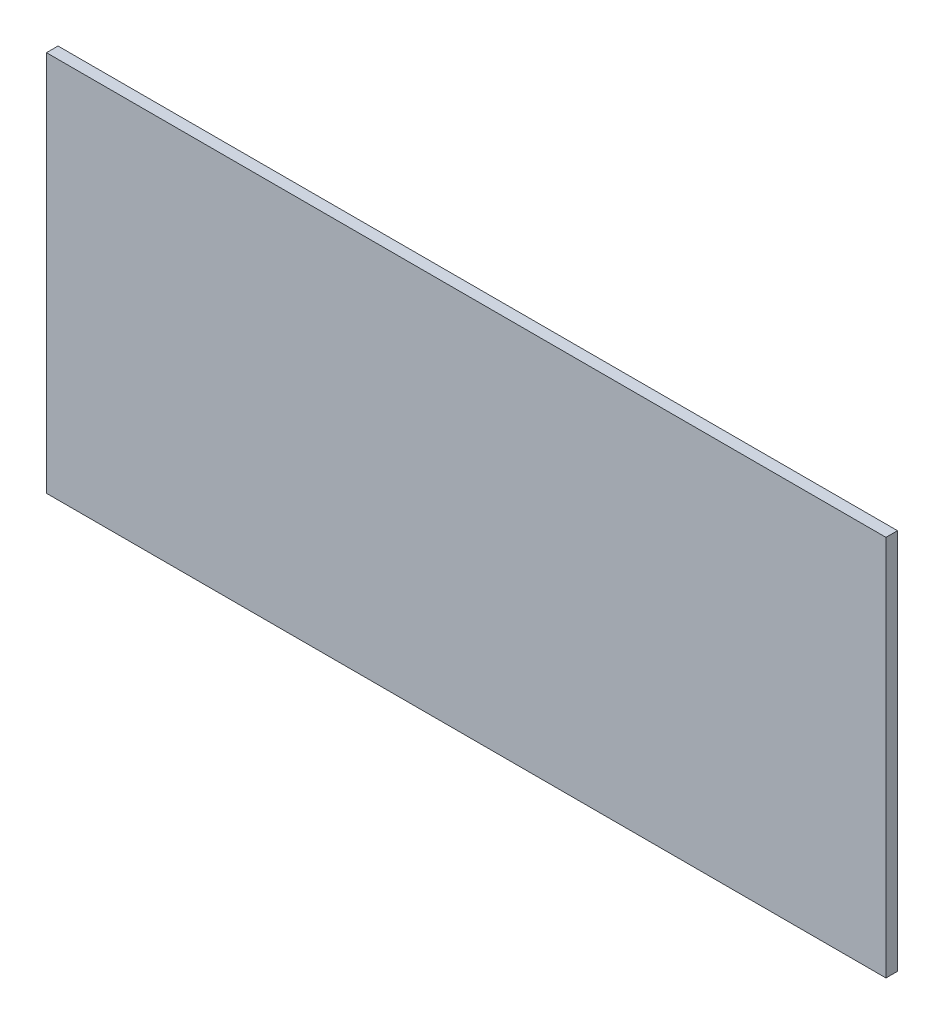
ISO-10303-21;
HEADER;
FILE_DESCRIPTION(('STEP AP214'),'2;1');
FILE_NAME('part.step','',(''),(''),'','','');
FILE_SCHEMA(('AUTOMOTIVE_DESIGN { 1 0 10303 214 1 1 1 1 }'));
ENDSEC;
DATA;
#1=APPLICATION_CONTEXT('core data for automotive mechanical design processes');
#2=APPLICATION_PROTOCOL_DEFINITION('international standard','automotive_design',2000,#1);
#3=PRODUCT_CONTEXT('',#1,'mechanical');
#4=PRODUCT('Part','Part','',(#3));
#5=PRODUCT_RELATED_PRODUCT_CATEGORY('part','',(#4));
#6=PRODUCT_DEFINITION_FORMATION('','',#4);
#7=PRODUCT_DEFINITION_CONTEXT('part definition',#1,'design');
#8=PRODUCT_DEFINITION('design','',#6,#7);
#9=PRODUCT_DEFINITION_SHAPE('','',#8);
#10=(LENGTH_UNIT() NAMED_UNIT(*) SI_UNIT(.MILLI.,.METRE.));
#11=(NAMED_UNIT(*) PLANE_ANGLE_UNIT() SI_UNIT($,.RADIAN.));
#12=(NAMED_UNIT(*) SI_UNIT($,.STERADIAN.) SOLID_ANGLE_UNIT());
#13=UNCERTAINTY_MEASURE_WITH_UNIT(LENGTH_MEASURE(1.E-05),#10,'distance_accuracy_value','');
#14=(GEOMETRIC_REPRESENTATION_CONTEXT(3) GLOBAL_UNCERTAINTY_ASSIGNED_CONTEXT((#13)) GLOBAL_UNIT_ASSIGNED_CONTEXT((#10,
#11,#12)) REPRESENTATION_CONTEXT('',''));
#15=CARTESIAN_POINT('',(0.,0.,0.));
#16=DIRECTION('',(0.,0.,1.));
#17=DIRECTION('',(1.,0.,0.));
#18=AXIS2_PLACEMENT_3D('',#15,#16,#17);
#19=CARTESIAN_POINT('',(0.,0.,0.));
#20=DIRECTION('',(0.,0.,1.));
#21=DIRECTION('',(1.,0.,0.));
#22=AXIS2_PLACEMENT_3D('',#19,#20,#21);
#23=PLANE('',#22);
#24=DIRECTION('',(1.,0.,0.));
#25=VECTOR('',#24,1.);
#26=CARTESIAN_POINT('',(3.632,1.651,0.));
#27=LINE('',#26,#25);
#28=CARTESIAN_POINT('',(3.632,1.651,0.));
#29=VERTEX_POINT('',#28);
#30=CARTESIAN_POINT('',(-3.632,1.651,0.));
#31=VERTEX_POINT('',#30);
#32=EDGE_CURVE('E78',#29,#31,#27,.F.);
#33=ORIENTED_EDGE('',*,*,#32,.F.);
#34=DIRECTION('',(0.,1.,0.));
#35=VECTOR('',#34,1.);
#36=CARTESIAN_POINT('',(3.632,-1.651,0.));
#37=LINE('',#36,#35);
#38=CARTESIAN_POINT('',(3.632,-1.651,0.));
#39=VERTEX_POINT('',#38);
#40=EDGE_CURVE('E54',#39,#29,#37,.T.);
#41=ORIENTED_EDGE('',*,*,#40,.F.);
#42=DIRECTION('',(1.,0.,0.));
#43=VECTOR('',#42,1.);
#44=CARTESIAN_POINT('',(-3.632,-1.651,0.));
#45=LINE('',#44,#43);
#46=CARTESIAN_POINT('',(-3.632,-1.651,0.));
#47=VERTEX_POINT('',#46);
#48=EDGE_CURVE('E56',#47,#39,#45,.T.);
#49=ORIENTED_EDGE('',*,*,#48,.F.);
#50=DIRECTION('',(0.,1.,0.));
#51=VECTOR('',#50,1.);
#52=CARTESIAN_POINT('',(-3.632,1.651,0.));
#53=LINE('',#52,#51);
#54=EDGE_CURVE('E19',#31,#47,#53,.F.);
#55=ORIENTED_EDGE('',*,*,#54,.F.);
#56=EDGE_LOOP('',(#33,#41,#49,#55));
#57=FACE_BOUND('',#56,.T.);
#58=ADVANCED_FACE('F16',(#57),#23,.F.);
#59=CARTESIAN_POINT('',(-3.632,1.651,0.));
#60=DIRECTION('',(-1.,0.,0.));
#61=DIRECTION('',(0.,0.,1.));
#62=AXIS2_PLACEMENT_3D('',#59,#60,#61);
#63=PLANE('',#62);
#64=DIRECTION('',(0.,1.,0.));
#65=VECTOR('',#64,1.);
#66=CARTESIAN_POINT('',(-3.632,0.,0.1));
#67=LINE('',#66,#65);
#68=CARTESIAN_POINT('',(-3.632,1.651,0.1));
#69=VERTEX_POINT('',#68);
#70=CARTESIAN_POINT('',(-3.632,-1.651,0.1));
#71=VERTEX_POINT('',#70);
#72=EDGE_CURVE('E82',#69,#71,#67,.F.);
#73=ORIENTED_EDGE('',*,*,#72,.F.);
#74=DIRECTION('',(0.,0.,1.));
#75=VECTOR('',#74,1.);
#76=CARTESIAN_POINT('',(-3.632,1.651,0.));
#77=LINE('',#76,#75);
#78=EDGE_CURVE('E67',#31,#69,#77,.T.);
#79=ORIENTED_EDGE('',*,*,#78,.F.);
#80=ORIENTED_EDGE('',*,*,#54,.T.);
#81=DIRECTION('',(0.,0.,-1.));
#82=VECTOR('',#81,1.);
#83=CARTESIAN_POINT('',(-3.632,-1.651,0.));
#84=LINE('',#83,#82);
#85=EDGE_CURVE('E62',#71,#47,#84,.T.);
#86=ORIENTED_EDGE('',*,*,#85,.F.);
#87=EDGE_LOOP('',(#73,#79,#80,#86));
#88=FACE_BOUND('',#87,.T.);
#89=ADVANCED_FACE('F64',(#88),#63,.T.);
#90=CARTESIAN_POINT('',(-3.632,-1.651,0.));
#91=DIRECTION('',(0.,-1.,0.));
#92=DIRECTION('',(0.,0.,-1.));
#93=AXIS2_PLACEMENT_3D('',#90,#91,#92);
#94=PLANE('',#93);
#95=DIRECTION('',(1.,0.,0.));
#96=VECTOR('',#95,1.);
#97=CARTESIAN_POINT('',(0.,-1.651,0.1));
#98=LINE('',#97,#96);
#99=CARTESIAN_POINT('',(3.632,-1.651,0.1));
#100=VERTEX_POINT('',#99);
#101=EDGE_CURVE('E71',#71,#100,#98,.T.);
#102=ORIENTED_EDGE('',*,*,#101,.F.);
#103=ORIENTED_EDGE('',*,*,#85,.T.);
#104=ORIENTED_EDGE('',*,*,#48,.T.);
#105=DIRECTION('',(0.,0.,-1.));
#106=VECTOR('',#105,1.);
#107=CARTESIAN_POINT('',(3.632,-1.651,0.));
#108=LINE('',#107,#106);
#109=EDGE_CURVE('E74',#100,#39,#108,.T.);
#110=ORIENTED_EDGE('',*,*,#109,.F.);
#111=EDGE_LOOP('',(#102,#103,#104,#110));
#112=FACE_BOUND('',#111,.T.);
#113=ADVANCED_FACE('F69',(#112),#94,.T.);
#114=CARTESIAN_POINT('',(3.632,-1.651,0.));
#115=DIRECTION('',(1.,0.,0.));
#116=DIRECTION('',(0.,0.,-1.));
#117=AXIS2_PLACEMENT_3D('',#114,#115,#116);
#118=PLANE('',#117);
#119=DIRECTION('',(0.,1.,0.));
#120=VECTOR('',#119,1.);
#121=CARTESIAN_POINT('',(3.632,0.,0.1));
#122=LINE('',#121,#120);
#123=CARTESIAN_POINT('',(3.632,1.651,0.1));
#124=VERTEX_POINT('',#123);
#125=EDGE_CURVE('E25',#100,#124,#122,.T.);
#126=ORIENTED_EDGE('',*,*,#125,.F.);
#127=ORIENTED_EDGE('',*,*,#109,.T.);
#128=ORIENTED_EDGE('',*,*,#40,.T.);
#129=DIRECTION('',(0.,0.,1.));
#130=VECTOR('',#129,1.);
#131=CARTESIAN_POINT('',(3.632,1.651,0.));
#132=LINE('',#131,#130);
#133=EDGE_CURVE('E34',#124,#29,#132,.F.);
#134=ORIENTED_EDGE('',*,*,#133,.F.);
#135=EDGE_LOOP('',(#126,#127,#128,#134));
#136=FACE_BOUND('',#135,.T.);
#137=ADVANCED_FACE('F88',(#136),#118,.T.);
#138=CARTESIAN_POINT('',(3.632,1.651,0.));
#139=DIRECTION('',(0.,1.,0.));
#140=DIRECTION('',(0.,0.,1.));
#141=AXIS2_PLACEMENT_3D('',#138,#139,#140);
#142=PLANE('',#141);
#143=DIRECTION('',(1.,0.,0.));
#144=VECTOR('',#143,1.);
#145=CARTESIAN_POINT('',(0.,1.651,0.1));
#146=LINE('',#145,#144);
#147=EDGE_CURVE('E11',#124,#69,#146,.F.);
#148=ORIENTED_EDGE('',*,*,#147,.F.);
#149=ORIENTED_EDGE('',*,*,#133,.T.);
#150=ORIENTED_EDGE('',*,*,#32,.T.);
#151=ORIENTED_EDGE('',*,*,#78,.T.);
#152=EDGE_LOOP('',(#148,#149,#150,#151));
#153=FACE_BOUND('',#152,.T.);
#154=ADVANCED_FACE('F90',(#153),#142,.T.);
#155=CARTESIAN_POINT('',(0.,0.,0.1));
#156=DIRECTION('',(0.,0.,1.));
#157=DIRECTION('',(1.,0.,0.));
#158=AXIS2_PLACEMENT_3D('',#155,#156,#157);
#159=PLANE('',#158);
#160=ORIENTED_EDGE('',*,*,#125,.T.);
#161=ORIENTED_EDGE('',*,*,#147,.T.);
#162=ORIENTED_EDGE('',*,*,#72,.T.);
#163=ORIENTED_EDGE('',*,*,#101,.T.);
#164=EDGE_LOOP('',(#160,#161,#162,#163));
#165=FACE_BOUND('',#164,.T.);
#166=ADVANCED_FACE('F87',(#165),#159,.T.);
#167=CLOSED_SHELL('',(#58,#89,#113,#137,#154,#166));
#168=MANIFOLD_SOLID_BREP('B1',#167);
#169=ADVANCED_BREP_SHAPE_REPRESENTATION('',(#18,#168),#14);
#170=SHAPE_DEFINITION_REPRESENTATION(#9,#169);
ENDSEC;
END-ISO-10303-21;
